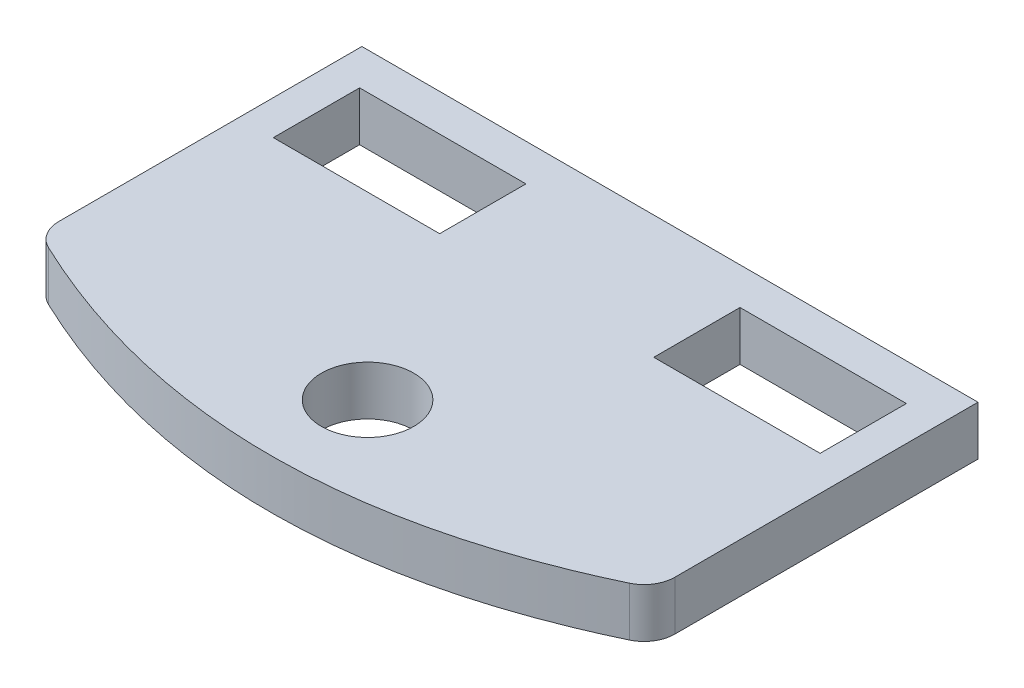
ISO-10303-21;
HEADER;
FILE_DESCRIPTION(('STEP AP214'),'2;1');
FILE_NAME('part.step','',(''),(''),'','','');
FILE_SCHEMA(('AUTOMOTIVE_DESIGN { 1 0 10303 214 1 1 1 1 }'));
ENDSEC;
DATA;
#1=APPLICATION_CONTEXT('core data for automotive mechanical design processes');
#2=APPLICATION_PROTOCOL_DEFINITION('international standard','automotive_design',2000,#1);
#3=PRODUCT_CONTEXT('',#1,'mechanical');
#4=PRODUCT('Part','Part','',(#3));
#5=PRODUCT_RELATED_PRODUCT_CATEGORY('part','',(#4));
#6=PRODUCT_DEFINITION_FORMATION('','',#4);
#7=PRODUCT_DEFINITION_CONTEXT('part definition',#1,'design');
#8=PRODUCT_DEFINITION('design','',#6,#7);
#9=PRODUCT_DEFINITION_SHAPE('','',#8);
#10=(LENGTH_UNIT() NAMED_UNIT(*) SI_UNIT(.MILLI.,.METRE.));
#11=(NAMED_UNIT(*) PLANE_ANGLE_UNIT() SI_UNIT($,.RADIAN.));
#12=(NAMED_UNIT(*) SI_UNIT($,.STERADIAN.) SOLID_ANGLE_UNIT());
#13=UNCERTAINTY_MEASURE_WITH_UNIT(LENGTH_MEASURE(1.E-05),#10,'distance_accuracy_value','');
#14=(GEOMETRIC_REPRESENTATION_CONTEXT(3) GLOBAL_UNCERTAINTY_ASSIGNED_CONTEXT((#13)) GLOBAL_UNIT_ASSIGNED_CONTEXT((#10,
#11,#12)) REPRESENTATION_CONTEXT('',''));
#15=CARTESIAN_POINT('',(0.,0.,0.));
#16=DIRECTION('',(0.,0.,1.));
#17=DIRECTION('',(1.,0.,0.));
#18=AXIS2_PLACEMENT_3D('',#15,#16,#17);
#19=CARTESIAN_POINT('',(-9.00000000000001,1.6,4.20546928304808));
#20=DIRECTION('',(0.,1.,0.));
#21=DIRECTION('',(0.,0.,1.));
#22=AXIS2_PLACEMENT_3D('',#19,#20,#21);
#23=PLANE('',#22);
#24=DIRECTION('',(0.,0.,-1.));
#25=VECTOR('',#24,1.);
#26=CARTESIAN_POINT('',(8.875,1.6,-1.63453071695192));
#27=LINE('',#26,#25);
#28=CARTESIAN_POINT('',(8.875,1.6,-1.63453071695192));
#29=VERTEX_POINT('',#28);
#30=CARTESIAN_POINT('',(8.875,1.6,-4.43453071695192));
#31=VERTEX_POINT('',#30);
#32=EDGE_CURVE('E150',#29,#31,#27,.T.);
#33=ORIENTED_EDGE('',*,*,#32,.F.);
#34=DIRECTION('',(1.,0.,0.));
#35=VECTOR('',#34,1.);
#36=CARTESIAN_POINT('',(8.875,1.6,-1.63453071695192));
#37=LINE('',#36,#35);
#38=CARTESIAN_POINT('',(3.475,1.6,-1.63453071695192));
#39=VERTEX_POINT('',#38);
#40=EDGE_CURVE('E141',#39,#29,#37,.T.);
#41=ORIENTED_EDGE('',*,*,#40,.F.);
#42=DIRECTION('',(0.,0.,1.));
#43=VECTOR('',#42,1.);
#44=CARTESIAN_POINT('',(3.475,1.6,-1.63453071695192));
#45=LINE('',#44,#43);
#46=CARTESIAN_POINT('',(3.475,1.6,-4.43453071695192));
#47=VERTEX_POINT('',#46);
#48=EDGE_CURVE('E168',#47,#39,#45,.T.);
#49=ORIENTED_EDGE('',*,*,#48,.F.);
#50=DIRECTION('',(-1.,0.,0.));
#51=VECTOR('',#50,1.);
#52=CARTESIAN_POINT('',(8.875,1.6,-4.43453071695192));
#53=LINE('',#52,#51);
#54=EDGE_CURVE('E164',#31,#47,#53,.T.);
#55=ORIENTED_EDGE('',*,*,#54,.F.);
#56=EDGE_LOOP('',(#33,#41,#49,#55));
#57=FACE_BOUND('',#56,.T.);
#58=DIRECTION('',(-1.,0.,0.));
#59=VECTOR('',#58,1.);
#60=CARTESIAN_POINT('',(-8.875,1.6,-4.43453071695192));
#61=LINE('',#60,#59);
#62=CARTESIAN_POINT('',(-3.475,1.6,-4.43453071695192));
#63=VERTEX_POINT('',#62);
#64=CARTESIAN_POINT('',(-8.875,1.6,-4.43453071695192));
#65=VERTEX_POINT('',#64);
#66=EDGE_CURVE('E195',#63,#65,#61,.T.);
#67=ORIENTED_EDGE('',*,*,#66,.F.);
#68=DIRECTION('',(0.,0.,-1.));
#69=VECTOR('',#68,1.);
#70=CARTESIAN_POINT('',(-3.475,1.6,-1.63453071695192));
#71=LINE('',#70,#69);
#72=CARTESIAN_POINT('',(-3.475,1.6,-1.63453071695192));
#73=VERTEX_POINT('',#72);
#74=EDGE_CURVE('E192',#73,#63,#71,.T.);
#75=ORIENTED_EDGE('',*,*,#74,.F.);
#76=DIRECTION('',(1.,0.,0.));
#77=VECTOR('',#76,1.);
#78=CARTESIAN_POINT('',(-8.875,1.6,-1.63453071695192));
#79=LINE('',#78,#77);
#80=CARTESIAN_POINT('',(-8.875,1.6,-1.63453071695192));
#81=VERTEX_POINT('',#80);
#82=EDGE_CURVE('E203',#81,#73,#79,.T.);
#83=ORIENTED_EDGE('',*,*,#82,.F.);
#84=DIRECTION('',(0.,0.,1.));
#85=VECTOR('',#84,1.);
#86=CARTESIAN_POINT('',(-8.875,1.6,-1.63453071695192));
#87=LINE('',#86,#85);
#88=EDGE_CURVE('E199',#65,#81,#87,.T.);
#89=ORIENTED_EDGE('',*,*,#88,.F.);
#90=EDGE_LOOP('',(#67,#75,#83,#89));
#91=FACE_BOUND('',#90,.T.);
#92=DIRECTION('',(0.,0.,1.));
#93=VECTOR('',#92,1.);
#94=CARTESIAN_POINT('',(-10.,1.6,-5.63453071695192));
#95=LINE('',#94,#93);
#96=CARTESIAN_POINT('',(-10.,1.6,-5.63453071695192));
#97=VERTEX_POINT('',#96);
#98=CARTESIAN_POINT('',(-10.,1.6,4.20546928304806));
#99=VERTEX_POINT('',#98);
#100=EDGE_CURVE('E235',#97,#99,#95,.T.);
#101=ORIENTED_EDGE('',*,*,#100,.T.);
#102=CARTESIAN_POINT('',(-9.00000000000001,1.6,4.20546928304808));
#103=DIRECTION('',(0.,1.,0.));
#104=DIRECTION('',(0.,0.,1.));
#105=AXIS2_PLACEMENT_3D('',#102,#103,#104);
#106=CIRCLE('',#105,0.999999999999998);
#107=CARTESIAN_POINT('',(-9.42819558676374,1.6,5.10915536763502));
#108=VERTEX_POINT('',#107);
#109=EDGE_CURVE('E239',#99,#108,#106,.T.);
#110=ORIENTED_EDGE('',*,*,#109,.T.);
#111=CARTESIAN_POINT('',(-9.42819558676374,1.6,5.10915536763502));
#112=CARTESIAN_POINT('',(-6.28603157474735,1.6,6.59801392790314));
#113=CARTESIAN_POINT('',(-0.0090429904074061,1.6,8.08727774638704));
#114=CARTESIAN_POINT('',(6.30649646854869,1.6,6.59881798438841));
#115=CARTESIAN_POINT('',(9.43025966638794,1.6,5.10992730365937));
#116=B_SPLINE_CURVE_WITH_KNOTS('',3,(#111,#112,#113,#114,#115),.UNSPECIFIED.,.F.,.F.,(4,1,4),
(0.0285902206617865,0.499914822464191,0.971328472811395),.UNSPECIFIED.);
#117=CARTESIAN_POINT('',(9.43025966638794,1.6,5.10992730365937));
#118=VERTEX_POINT('',#117);
#119=EDGE_CURVE('E243',#108,#118,#116,.T.);
#120=ORIENTED_EDGE('',*,*,#119,.T.);
#121=CARTESIAN_POINT('',(9.,1.6,4.20722213613249));
#122=DIRECTION('',(0.,1.,0.));
#123=DIRECTION('',(0.,0.,1.));
#124=AXIS2_PLACEMENT_3D('',#121,#122,#123);
#125=CIRCLE('',#124,0.999999999999998);
#126=CARTESIAN_POINT('',(10.,1.6,4.20722213613247));
#127=VERTEX_POINT('',#126);
#128=EDGE_CURVE('E249',#118,#127,#125,.T.);
#129=ORIENTED_EDGE('',*,*,#128,.T.);
#130=DIRECTION('',(0.,0.,-1.));
#131=VECTOR('',#130,1.);
#132=CARTESIAN_POINT('',(10.,1.6,-5.63453071695192));
#133=LINE('',#132,#131);
#134=CARTESIAN_POINT('',(10.,1.6,-5.63453071695192));
#135=VERTEX_POINT('',#134);
#136=EDGE_CURVE('E348',#127,#135,#133,.T.);
#137=ORIENTED_EDGE('',*,*,#136,.T.);
#138=DIRECTION('',(-1.,0.,0.));
#139=VECTOR('',#138,1.);
#140=CARTESIAN_POINT('',(-10.,1.6,-5.63453071695192));
#141=LINE('',#140,#139);
#142=EDGE_CURVE('E308',#135,#97,#141,.T.);
#143=ORIENTED_EDGE('',*,*,#142,.T.);
#144=EDGE_LOOP('',(#101,#110,#120,#129,#137,#143));
#145=FACE_BOUND('',#144,.T.);
#146=CARTESIAN_POINT('',(0.0249999999999981,1.6,4.20546928304808));
#147=DIRECTION('',(0.,1.,0.));
#148=DIRECTION('',(0.,0.,1.));
#149=AXIS2_PLACEMENT_3D('',#146,#147,#148);
#150=CIRCLE('',#149,1.5);
#151=CARTESIAN_POINT('',(0.0249999999999981,1.6,5.70546928304808));
#152=VERTEX_POINT('',#151);
#153=EDGE_CURVE('E176',#152,#152,#150,.T.);
#154=ORIENTED_EDGE('',*,*,#153,.F.);
#155=EDGE_LOOP('',(#154));
#156=FACE_BOUND('',#155,.T.);
#157=ADVANCED_FACE('F39',(#57,#91,#145,#156),#23,.T.);
#158=CARTESIAN_POINT('',(-9.00000000000001,0.,4.20546928304808));
#159=DIRECTION('',(0.,1.,0.));
#160=DIRECTION('',(0.,0.,1.));
#161=AXIS2_PLACEMENT_3D('',#158,#159,#160);
#162=PLANE('',#161);
#163=DIRECTION('',(0.,0.,-1.));
#164=VECTOR('',#163,1.);
#165=CARTESIAN_POINT('',(-3.475,0.,-1.63453071695192));
#166=LINE('',#165,#164);
#167=CARTESIAN_POINT('',(-3.475,0.,-1.63453071695192));
#168=VERTEX_POINT('',#167);
#169=CARTESIAN_POINT('',(-3.475,0.,-4.43453071695192));
#170=VERTEX_POINT('',#169);
#171=EDGE_CURVE('E159',#168,#170,#166,.T.);
#172=ORIENTED_EDGE('',*,*,#171,.T.);
#173=DIRECTION('',(-1.,0.,0.));
#174=VECTOR('',#173,1.);
#175=CARTESIAN_POINT('',(-8.875,0.,-4.43453071695192));
#176=LINE('',#175,#174);
#177=CARTESIAN_POINT('',(-8.875,0.,-4.43453071695192));
#178=VERTEX_POINT('',#177);
#179=EDGE_CURVE('E210',#170,#178,#176,.T.);
#180=ORIENTED_EDGE('',*,*,#179,.T.);
#181=DIRECTION('',(0.,0.,1.));
#182=VECTOR('',#181,1.);
#183=CARTESIAN_POINT('',(-8.875,0.,-1.63453071695192));
#184=LINE('',#183,#182);
#185=CARTESIAN_POINT('',(-8.875,0.,-1.63453071695192));
#186=VERTEX_POINT('',#185);
#187=EDGE_CURVE('E214',#178,#186,#184,.T.);
#188=ORIENTED_EDGE('',*,*,#187,.T.);
#189=DIRECTION('',(1.,0.,0.));
#190=VECTOR('',#189,1.);
#191=CARTESIAN_POINT('',(-8.875,0.,-1.63453071695192));
#192=LINE('',#191,#190);
#193=EDGE_CURVE('E196',#186,#168,#192,.T.);
#194=ORIENTED_EDGE('',*,*,#193,.T.);
#195=EDGE_LOOP('',(#172,#180,#188,#194));
#196=FACE_BOUND('',#195,.T.);
#197=DIRECTION('',(0.,0.,1.));
#198=VECTOR('',#197,1.);
#199=CARTESIAN_POINT('',(-10.,0.,-5.63453071695192));
#200=LINE('',#199,#198);
#201=CARTESIAN_POINT('',(-10.,0.,-5.63453071695192));
#202=VERTEX_POINT('',#201);
#203=CARTESIAN_POINT('',(-10.,0.,4.20546928304806));
#204=VERTEX_POINT('',#203);
#205=EDGE_CURVE('E234',#202,#204,#200,.T.);
#206=ORIENTED_EDGE('',*,*,#205,.F.);
#207=DIRECTION('',(-1.,0.,0.));
#208=VECTOR('',#207,1.);
#209=CARTESIAN_POINT('',(-10.,0.,-5.63453071695192));
#210=LINE('',#209,#208);
#211=CARTESIAN_POINT('',(10.,0.,-5.63453071695192));
#212=VERTEX_POINT('',#211);
#213=EDGE_CURVE('E240',#212,#202,#210,.T.);
#214=ORIENTED_EDGE('',*,*,#213,.F.);
#215=DIRECTION('',(0.,0.,-1.));
#216=VECTOR('',#215,1.);
#217=CARTESIAN_POINT('',(10.,0.,-5.63453071695192));
#218=LINE('',#217,#216);
#219=CARTESIAN_POINT('',(10.,0.,4.20722213613247));
#220=VERTEX_POINT('',#219);
#221=EDGE_CURVE('E293',#220,#212,#218,.T.);
#222=ORIENTED_EDGE('',*,*,#221,.F.);
#223=CARTESIAN_POINT('',(9.,0.,4.20722213613249));
#224=DIRECTION('',(0.,1.,0.));
#225=DIRECTION('',(0.,0.,1.));
#226=AXIS2_PLACEMENT_3D('',#223,#224,#225);
#227=CIRCLE('',#226,0.999999999999998);
#228=CARTESIAN_POINT('',(9.43025966638794,0.,5.10992730365937));
#229=VERTEX_POINT('',#228);
#230=EDGE_CURVE('E304',#229,#220,#227,.T.);
#231=ORIENTED_EDGE('',*,*,#230,.F.);
#232=CARTESIAN_POINT('',(-9.42819558676374,0.,5.10915536763502));
#233=CARTESIAN_POINT('',(-6.28603157474735,0.,6.59801392790314));
#234=CARTESIAN_POINT('',(-0.0090429904074061,0.,8.08727774638704));
#235=CARTESIAN_POINT('',(6.30649646854869,0.,6.59881798438841));
#236=CARTESIAN_POINT('',(9.43025966638794,0.,5.10992730365937));
#237=B_SPLINE_CURVE_WITH_KNOTS('',3,(#232,#233,#234,#235,#236),.UNSPECIFIED.,.F.,.F.,(4,1,4),
(0.0285902206617865,0.499914822464191,0.971328472811395),.UNSPECIFIED.);
#238=CARTESIAN_POINT('',(-9.42819558676374,0.,5.10915536763502));
#239=VERTEX_POINT('',#238);
#240=EDGE_CURVE('E332',#239,#229,#237,.T.);
#241=ORIENTED_EDGE('',*,*,#240,.F.);
#242=CARTESIAN_POINT('',(-9.00000000000001,0.,4.20546928304808));
#243=DIRECTION('',(0.,1.,0.));
#244=DIRECTION('',(0.,0.,1.));
#245=AXIS2_PLACEMENT_3D('',#242,#243,#244);
#246=CIRCLE('',#245,0.999999999999998);
#247=EDGE_CURVE('E333',#204,#239,#246,.T.);
#248=ORIENTED_EDGE('',*,*,#247,.F.);
#249=EDGE_LOOP('',(#206,#214,#222,#231,#241,#248));
#250=FACE_BOUND('',#249,.T.);
#251=DIRECTION('',(1.,0.,0.));
#252=VECTOR('',#251,1.);
#253=CARTESIAN_POINT('',(8.875,0.,-1.63453071695192));
#254=LINE('',#253,#252);
#255=CARTESIAN_POINT('',(3.475,0.,-1.63453071695192));
#256=VERTEX_POINT('',#255);
#257=CARTESIAN_POINT('',(8.875,0.,-1.63453071695192));
#258=VERTEX_POINT('',#257);
#259=EDGE_CURVE('E63',#256,#258,#254,.T.);
#260=ORIENTED_EDGE('',*,*,#259,.T.);
#261=DIRECTION('',(0.,0.,-1.));
#262=VECTOR('',#261,1.);
#263=CARTESIAN_POINT('',(8.875,0.,-1.63453071695192));
#264=LINE('',#263,#262);
#265=CARTESIAN_POINT('',(8.875,0.,-4.43453071695192));
#266=VERTEX_POINT('',#265);
#267=EDGE_CURVE('E157',#258,#266,#264,.T.);
#268=ORIENTED_EDGE('',*,*,#267,.T.);
#269=DIRECTION('',(-1.,0.,0.));
#270=VECTOR('',#269,1.);
#271=CARTESIAN_POINT('',(8.875,0.,-4.43453071695192));
#272=LINE('',#271,#270);
#273=CARTESIAN_POINT('',(3.475,0.,-4.43453071695192));
#274=VERTEX_POINT('',#273);
#275=EDGE_CURVE('E179',#266,#274,#272,.T.);
#276=ORIENTED_EDGE('',*,*,#275,.T.);
#277=DIRECTION('',(0.,0.,1.));
#278=VECTOR('',#277,1.);
#279=CARTESIAN_POINT('',(3.475,0.,-1.63453071695192));
#280=LINE('',#279,#278);
#281=EDGE_CURVE('E151',#274,#256,#280,.T.);
#282=ORIENTED_EDGE('',*,*,#281,.T.);
#283=EDGE_LOOP('',(#260,#268,#276,#282));
#284=FACE_BOUND('',#283,.T.);
#285=CARTESIAN_POINT('',(0.0249999999999981,0.,4.20546928304808));
#286=DIRECTION('',(0.,1.,0.));
#287=DIRECTION('',(0.,0.,1.));
#288=AXIS2_PLACEMENT_3D('',#285,#286,#287);
#289=CIRCLE('',#288,1.5);
#290=CARTESIAN_POINT('',(0.0249999999999981,0.,5.70546928304808));
#291=VERTEX_POINT('',#290);
#292=EDGE_CURVE('E360',#291,#291,#289,.T.);
#293=ORIENTED_EDGE('',*,*,#292,.T.);
#294=EDGE_LOOP('',(#293));
#295=FACE_BOUND('',#294,.T.);
#296=ADVANCED_FACE('F267',(#196,#250,#284,#295),#162,.F.);
#297=CARTESIAN_POINT('',(-10.,1.6,-5.63453071695192));
#298=DIRECTION('',(1.,0.,0.));
#299=DIRECTION('',(0.,0.,-1.));
#300=AXIS2_PLACEMENT_3D('',#297,#298,#299);
#301=PLANE('',#300);
#302=ORIENTED_EDGE('',*,*,#205,.T.);
#303=DIRECTION('',(0.,-1.,0.));
#304=VECTOR('',#303,1.);
#305=CARTESIAN_POINT('',(-10.,1.6,4.20546928304806));
#306=LINE('',#305,#304);
#307=EDGE_CURVE('E11',#99,#204,#306,.T.);
#308=ORIENTED_EDGE('',*,*,#307,.F.);
#309=ORIENTED_EDGE('',*,*,#100,.F.);
#310=DIRECTION('',(0.,-1.,0.));
#311=VECTOR('',#310,1.);
#312=CARTESIAN_POINT('',(-10.,1.6,-5.63453071695192));
#313=LINE('',#312,#311);
#314=EDGE_CURVE('E310',#97,#202,#313,.T.);
#315=ORIENTED_EDGE('',*,*,#314,.T.);
#316=EDGE_LOOP('',(#302,#308,#309,#315));
#317=FACE_BOUND('',#316,.T.);
#318=ADVANCED_FACE('F41',(#317),#301,.F.);
#319=CARTESIAN_POINT('',(-9.00000000000001,1.6,4.20546928304808));
#320=DIRECTION('',(0.,-1.,0.));
#321=DIRECTION('',(0.,0.,-1.));
#322=AXIS2_PLACEMENT_3D('',#319,#320,#321);
#323=CYLINDRICAL_SURFACE('',#322,0.999999999999998);
#324=ORIENTED_EDGE('',*,*,#247,.T.);
#325=DIRECTION('',(0.,-1.,0.));
#326=VECTOR('',#325,1.);
#327=CARTESIAN_POINT('',(-9.42819558676374,1.6,5.10915536763502));
#328=LINE('',#327,#326);
#329=EDGE_CURVE('E48',#108,#239,#328,.T.);
#330=ORIENTED_EDGE('',*,*,#329,.F.);
#331=ORIENTED_EDGE('',*,*,#109,.F.);
#332=ORIENTED_EDGE('',*,*,#307,.T.);
#333=EDGE_LOOP('',(#324,#330,#331,#332));
#334=FACE_BOUND('',#333,.T.);
#335=ADVANCED_FACE('F259',(#334),#323,.T.);
#336=DIRECTION('',(0.,-1.,0.));
#337=VECTOR('',#336,1.);
#338=SURFACE_OF_LINEAR_EXTRUSION('',#116,#337);
#339=ORIENTED_EDGE('',*,*,#240,.T.);
#340=DIRECTION('',(0.,-1.,0.));
#341=VECTOR('',#340,1.);
#342=CARTESIAN_POINT('',(9.43025966638794,1.6,5.10992730365937));
#343=LINE('',#342,#341);
#344=EDGE_CURVE('E323',#118,#229,#343,.T.);
#345=ORIENTED_EDGE('',*,*,#344,.F.);
#346=ORIENTED_EDGE('',*,*,#119,.F.);
#347=ORIENTED_EDGE('',*,*,#329,.T.);
#348=EDGE_LOOP('',(#339,#345,#346,#347));
#349=FACE_BOUND('',#348,.T.);
#350=ADVANCED_FACE('F255',(#349),#338,.F.);
#351=CARTESIAN_POINT('',(9.,1.6,4.20722213613249));
#352=DIRECTION('',(0.,-1.,0.));
#353=DIRECTION('',(0.,0.,-1.));
#354=AXIS2_PLACEMENT_3D('',#351,#352,#353);
#355=CYLINDRICAL_SURFACE('',#354,0.999999999999998);
#356=ORIENTED_EDGE('',*,*,#230,.T.);
#357=DIRECTION('',(0.,-1.,0.));
#358=VECTOR('',#357,1.);
#359=CARTESIAN_POINT('',(10.,1.6,4.20722213613247));
#360=LINE('',#359,#358);
#361=EDGE_CURVE('E299',#127,#220,#360,.T.);
#362=ORIENTED_EDGE('',*,*,#361,.F.);
#363=ORIENTED_EDGE('',*,*,#128,.F.);
#364=ORIENTED_EDGE('',*,*,#344,.T.);
#365=EDGE_LOOP('',(#356,#362,#363,#364));
#366=FACE_BOUND('',#365,.T.);
#367=ADVANCED_FACE('F258',(#366),#355,.T.);
#368=CARTESIAN_POINT('',(10.,1.6,-5.63453071695192));
#369=DIRECTION('',(-1.,0.,0.));
#370=DIRECTION('',(0.,0.,1.));
#371=AXIS2_PLACEMENT_3D('',#368,#369,#370);
#372=PLANE('',#371);
#373=ORIENTED_EDGE('',*,*,#221,.T.);
#374=DIRECTION('',(0.,-1.,0.));
#375=VECTOR('',#374,1.);
#376=CARTESIAN_POINT('',(10.,1.6,-5.63453071695192));
#377=LINE('',#376,#375);
#378=EDGE_CURVE('E296',#135,#212,#377,.T.);
#379=ORIENTED_EDGE('',*,*,#378,.F.);
#380=ORIENTED_EDGE('',*,*,#136,.F.);
#381=ORIENTED_EDGE('',*,*,#361,.T.);
#382=EDGE_LOOP('',(#373,#379,#380,#381));
#383=FACE_BOUND('',#382,.T.);
#384=ADVANCED_FACE('F282',(#383),#372,.F.);
#385=CARTESIAN_POINT('',(-10.,1.6,-5.63453071695192));
#386=DIRECTION('',(0.,0.,1.));
#387=DIRECTION('',(1.,0.,0.));
#388=AXIS2_PLACEMENT_3D('',#385,#386,#387);
#389=PLANE('',#388);
#390=ORIENTED_EDGE('',*,*,#213,.T.);
#391=ORIENTED_EDGE('',*,*,#314,.F.);
#392=ORIENTED_EDGE('',*,*,#142,.F.);
#393=ORIENTED_EDGE('',*,*,#378,.T.);
#394=EDGE_LOOP('',(#390,#391,#392,#393));
#395=FACE_BOUND('',#394,.T.);
#396=ADVANCED_FACE('F280',(#395),#389,.F.);
#397=CARTESIAN_POINT('',(-3.475,1.6,-1.63453071695192));
#398=DIRECTION('',(-1.,0.,0.));
#399=DIRECTION('',(0.,0.,1.));
#400=AXIS2_PLACEMENT_3D('',#397,#398,#399);
#401=PLANE('',#400);
#402=ORIENTED_EDGE('',*,*,#171,.F.);
#403=DIRECTION('',(0.,-1.,0.));
#404=VECTOR('',#403,1.);
#405=CARTESIAN_POINT('',(-3.475,1.6,-1.63453071695192));
#406=LINE('',#405,#404);
#407=EDGE_CURVE('E206',#73,#168,#406,.T.);
#408=ORIENTED_EDGE('',*,*,#407,.F.);
#409=ORIENTED_EDGE('',*,*,#74,.T.);
#410=DIRECTION('',(0.,-1.,0.));
#411=VECTOR('',#410,1.);
#412=CARTESIAN_POINT('',(-3.475,1.6,-4.43453071695192));
#413=LINE('',#412,#411);
#414=EDGE_CURVE('E230',#63,#170,#413,.T.);
#415=ORIENTED_EDGE('',*,*,#414,.T.);
#416=EDGE_LOOP('',(#402,#408,#409,#415));
#417=FACE_BOUND('',#416,.T.);
#418=ADVANCED_FACE('F277',(#417),#401,.T.);
#419=CARTESIAN_POINT('',(-8.875,1.6,-4.43453071695192));
#420=DIRECTION('',(0.,0.,1.));
#421=DIRECTION('',(1.,0.,0.));
#422=AXIS2_PLACEMENT_3D('',#419,#420,#421);
#423=PLANE('',#422);
#424=ORIENTED_EDGE('',*,*,#179,.F.);
#425=ORIENTED_EDGE('',*,*,#414,.F.);
#426=ORIENTED_EDGE('',*,*,#66,.T.);
#427=DIRECTION('',(0.,-1.,0.));
#428=VECTOR('',#427,1.);
#429=CARTESIAN_POINT('',(-8.875,1.6,-4.43453071695192));
#430=LINE('',#429,#428);
#431=EDGE_CURVE('E227',#65,#178,#430,.T.);
#432=ORIENTED_EDGE('',*,*,#431,.T.);
#433=EDGE_LOOP('',(#424,#425,#426,#432));
#434=FACE_BOUND('',#433,.T.);
#435=ADVANCED_FACE('F390',(#434),#423,.T.);
#436=CARTESIAN_POINT('',(-8.875,1.6,-1.63453071695192));
#437=DIRECTION('',(1.,0.,0.));
#438=DIRECTION('',(0.,0.,-1.));
#439=AXIS2_PLACEMENT_3D('',#436,#437,#438);
#440=PLANE('',#439);
#441=ORIENTED_EDGE('',*,*,#187,.F.);
#442=ORIENTED_EDGE('',*,*,#431,.F.);
#443=ORIENTED_EDGE('',*,*,#88,.T.);
#444=DIRECTION('',(0.,-1.,0.));
#445=VECTOR('',#444,1.);
#446=CARTESIAN_POINT('',(-8.875,1.6,-1.63453071695192));
#447=LINE('',#446,#445);
#448=EDGE_CURVE('E224',#81,#186,#447,.T.);
#449=ORIENTED_EDGE('',*,*,#448,.T.);
#450=EDGE_LOOP('',(#441,#442,#443,#449));
#451=FACE_BOUND('',#450,.T.);
#452=ADVANCED_FACE('F387',(#451),#440,.T.);
#453=CARTESIAN_POINT('',(-8.875,1.6,-1.63453071695192));
#454=DIRECTION('',(0.,0.,-1.));
#455=DIRECTION('',(-1.,0.,0.));
#456=AXIS2_PLACEMENT_3D('',#453,#454,#455);
#457=PLANE('',#456);
#458=ORIENTED_EDGE('',*,*,#193,.F.);
#459=ORIENTED_EDGE('',*,*,#448,.F.);
#460=ORIENTED_EDGE('',*,*,#82,.T.);
#461=ORIENTED_EDGE('',*,*,#407,.T.);
#462=EDGE_LOOP('',(#458,#459,#460,#461));
#463=FACE_BOUND('',#462,.T.);
#464=ADVANCED_FACE('F384',(#463),#457,.T.);
#465=CARTESIAN_POINT('',(8.875,1.6,-1.63453071695192));
#466=DIRECTION('',(0.,0.,-1.));
#467=DIRECTION('',(-1.,0.,0.));
#468=AXIS2_PLACEMENT_3D('',#465,#466,#467);
#469=PLANE('',#468);
#470=ORIENTED_EDGE('',*,*,#259,.F.);
#471=DIRECTION('',(0.,-1.,0.));
#472=VECTOR('',#471,1.);
#473=CARTESIAN_POINT('',(3.475,1.6,-1.63453071695192));
#474=LINE('',#473,#472);
#475=EDGE_CURVE('E145',#39,#256,#474,.T.);
#476=ORIENTED_EDGE('',*,*,#475,.F.);
#477=ORIENTED_EDGE('',*,*,#40,.T.);
#478=DIRECTION('',(0.,-1.,0.));
#479=VECTOR('',#478,1.);
#480=CARTESIAN_POINT('',(8.875,1.6,-1.63453071695192));
#481=LINE('',#480,#479);
#482=EDGE_CURVE('E144',#29,#258,#481,.T.);
#483=ORIENTED_EDGE('',*,*,#482,.T.);
#484=EDGE_LOOP('',(#470,#476,#477,#483));
#485=FACE_BOUND('',#484,.T.);
#486=ADVANCED_FACE('F143',(#485),#469,.T.);
#487=CARTESIAN_POINT('',(8.875,1.6,-1.63453071695192));
#488=DIRECTION('',(-1.,0.,0.));
#489=DIRECTION('',(0.,0.,1.));
#490=AXIS2_PLACEMENT_3D('',#487,#488,#489);
#491=PLANE('',#490);
#492=ORIENTED_EDGE('',*,*,#267,.F.);
#493=ORIENTED_EDGE('',*,*,#482,.F.);
#494=ORIENTED_EDGE('',*,*,#32,.T.);
#495=DIRECTION('',(0.,-1.,0.));
#496=VECTOR('',#495,1.);
#497=CARTESIAN_POINT('',(8.875,1.6,-4.43453071695192));
#498=LINE('',#497,#496);
#499=EDGE_CURVE('E160',#31,#266,#498,.T.);
#500=ORIENTED_EDGE('',*,*,#499,.T.);
#501=EDGE_LOOP('',(#492,#493,#494,#500));
#502=FACE_BOUND('',#501,.T.);
#503=ADVANCED_FACE('F154',(#502),#491,.T.);
#504=CARTESIAN_POINT('',(8.875,1.6,-4.43453071695192));
#505=DIRECTION('',(0.,0.,1.));
#506=DIRECTION('',(1.,0.,0.));
#507=AXIS2_PLACEMENT_3D('',#504,#505,#506);
#508=PLANE('',#507);
#509=ORIENTED_EDGE('',*,*,#275,.F.);
#510=ORIENTED_EDGE('',*,*,#499,.F.);
#511=ORIENTED_EDGE('',*,*,#54,.T.);
#512=DIRECTION('',(0.,-1.,0.));
#513=VECTOR('',#512,1.);
#514=CARTESIAN_POINT('',(3.475,1.6,-4.43453071695192));
#515=LINE('',#514,#513);
#516=EDGE_CURVE('E55',#47,#274,#515,.T.);
#517=ORIENTED_EDGE('',*,*,#516,.T.);
#518=EDGE_LOOP('',(#509,#510,#511,#517));
#519=FACE_BOUND('',#518,.T.);
#520=ADVANCED_FACE('F374',(#519),#508,.T.);
#521=CARTESIAN_POINT('',(3.475,1.6,-1.63453071695192));
#522=DIRECTION('',(1.,0.,0.));
#523=DIRECTION('',(0.,0.,-1.));
#524=AXIS2_PLACEMENT_3D('',#521,#522,#523);
#525=PLANE('',#524);
#526=ORIENTED_EDGE('',*,*,#281,.F.);
#527=ORIENTED_EDGE('',*,*,#516,.F.);
#528=ORIENTED_EDGE('',*,*,#48,.T.);
#529=ORIENTED_EDGE('',*,*,#475,.T.);
#530=EDGE_LOOP('',(#526,#527,#528,#529));
#531=FACE_BOUND('',#530,.T.);
#532=ADVANCED_FACE('F369',(#531),#525,.T.);
#533=CARTESIAN_POINT('',(0.0249999999999981,1.6,4.20546928304808));
#534=DIRECTION('',(0.,-1.,0.));
#535=DIRECTION('',(0.,0.,-1.));
#536=AXIS2_PLACEMENT_3D('',#533,#534,#535);
#537=CYLINDRICAL_SURFACE('',#536,1.5);
#538=ORIENTED_EDGE('',*,*,#153,.T.);
#539=EDGE_LOOP('',(#538));
#540=FACE_BOUND('',#539,.T.);
#541=ORIENTED_EDGE('',*,*,#292,.F.);
#542=EDGE_LOOP('',(#541));
#543=FACE_BOUND('',#542,.T.);
#544=ADVANCED_FACE('F367',(#540,#543),#537,.F.);
#545=CLOSED_SHELL('',(#157,#296,#318,#335,#350,#367,#384,#396,#418,#435,#452,#464,#486,#503,
#520,#532,#544));
#546=MANIFOLD_SOLID_BREP('B2',#545);
#547=ADVANCED_BREP_SHAPE_REPRESENTATION('',(#18,#546),#14);
#548=SHAPE_DEFINITION_REPRESENTATION(#9,#547);
ENDSEC;
END-ISO-10303-21;
